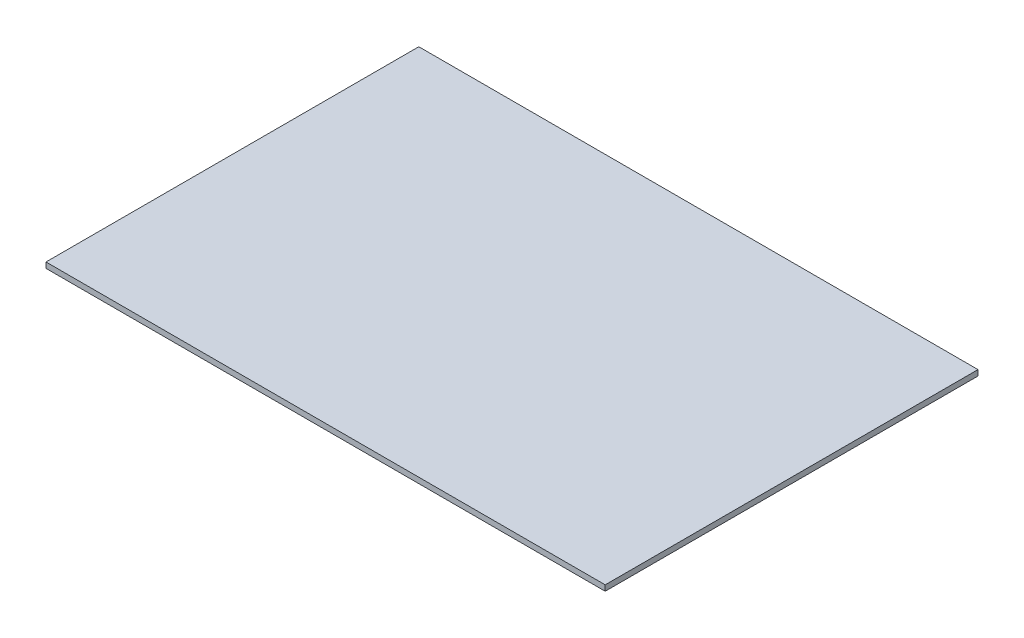
ISO-10303-21;
HEADER;
FILE_DESCRIPTION(('STEP AP214'),'2;1');
FILE_NAME('part.step','',(''),(''),'','','');
FILE_SCHEMA(('AUTOMOTIVE_DESIGN { 1 0 10303 214 1 1 1 1 }'));
ENDSEC;
DATA;
#1=APPLICATION_CONTEXT('core data for automotive mechanical design processes');
#2=APPLICATION_PROTOCOL_DEFINITION('international standard','automotive_design',2000,#1);
#3=PRODUCT_CONTEXT('',#1,'mechanical');
#4=PRODUCT('Part','Part','',(#3));
#5=PRODUCT_RELATED_PRODUCT_CATEGORY('part','',(#4));
#6=PRODUCT_DEFINITION_FORMATION('','',#4);
#7=PRODUCT_DEFINITION_CONTEXT('part definition',#1,'design');
#8=PRODUCT_DEFINITION('design','',#6,#7);
#9=PRODUCT_DEFINITION_SHAPE('','',#8);
#10=(LENGTH_UNIT() NAMED_UNIT(*) SI_UNIT(.MILLI.,.METRE.));
#11=(NAMED_UNIT(*) PLANE_ANGLE_UNIT() SI_UNIT($,.RADIAN.));
#12=(NAMED_UNIT(*) SI_UNIT($,.STERADIAN.) SOLID_ANGLE_UNIT());
#13=UNCERTAINTY_MEASURE_WITH_UNIT(LENGTH_MEASURE(1.E-05),#10,'distance_accuracy_value','');
#14=(GEOMETRIC_REPRESENTATION_CONTEXT(3) GLOBAL_UNCERTAINTY_ASSIGNED_CONTEXT((#13)) GLOBAL_UNIT_ASSIGNED_CONTEXT((#10,
#11,#12)) REPRESENTATION_CONTEXT('',''));
#15=CARTESIAN_POINT('',(0.,0.,0.));
#16=DIRECTION('',(0.,0.,1.));
#17=DIRECTION('',(1.,0.,0.));
#18=AXIS2_PLACEMENT_3D('',#15,#16,#17);
#19=CARTESIAN_POINT('',(150.,3.,100.));
#20=DIRECTION('',(-1.,0.,0.));
#21=DIRECTION('',(0.,0.,1.));
#22=AXIS2_PLACEMENT_3D('',#19,#20,#21);
#23=PLANE('',#22);
#24=DIRECTION('',(0.,0.,-1.));
#25=VECTOR('',#24,1.);
#26=CARTESIAN_POINT('',(150.,0.,100.));
#27=LINE('',#26,#25);
#28=CARTESIAN_POINT('',(150.,0.,100.));
#29=VERTEX_POINT('',#28);
#30=CARTESIAN_POINT('',(150.,0.,-100.));
#31=VERTEX_POINT('',#30);
#32=EDGE_CURVE('E96',#29,#31,#27,.T.);
#33=ORIENTED_EDGE('',*,*,#32,.T.);
#34=DIRECTION('',(0.,-1.,0.));
#35=VECTOR('',#34,1.);
#36=CARTESIAN_POINT('',(150.,3.,-100.));
#37=LINE('',#36,#35);
#38=CARTESIAN_POINT('',(150.,3.,-100.));
#39=VERTEX_POINT('',#38);
#40=EDGE_CURVE('E11',#39,#31,#37,.T.);
#41=ORIENTED_EDGE('',*,*,#40,.F.);
#42=DIRECTION('',(0.,0.,-1.));
#43=VECTOR('',#42,1.);
#44=CARTESIAN_POINT('',(150.,3.,100.));
#45=LINE('',#44,#43);
#46=CARTESIAN_POINT('',(150.,3.,100.));
#47=VERTEX_POINT('',#46);
#48=EDGE_CURVE('E84',#47,#39,#45,.T.);
#49=ORIENTED_EDGE('',*,*,#48,.F.);
#50=DIRECTION('',(0.,-1.,0.));
#51=VECTOR('',#50,1.);
#52=CARTESIAN_POINT('',(150.,3.,100.));
#53=LINE('',#52,#51);
#54=EDGE_CURVE('E92',#47,#29,#53,.T.);
#55=ORIENTED_EDGE('',*,*,#54,.T.);
#56=EDGE_LOOP('',(#33,#41,#49,#55));
#57=FACE_BOUND('',#56,.T.);
#58=ADVANCED_FACE('F33',(#57),#23,.F.);
#59=CARTESIAN_POINT('',(-150.,3.,-100.));
#60=DIRECTION('',(0.,0.,1.));
#61=DIRECTION('',(1.,0.,0.));
#62=AXIS2_PLACEMENT_3D('',#59,#60,#61);
#63=PLANE('',#62);
#64=DIRECTION('',(-1.,0.,0.));
#65=VECTOR('',#64,1.);
#66=CARTESIAN_POINT('',(-150.,0.,-100.));
#67=LINE('',#66,#65);
#68=CARTESIAN_POINT('',(-150.,0.,-100.));
#69=VERTEX_POINT('',#68);
#70=EDGE_CURVE('E88',#31,#69,#67,.T.);
#71=ORIENTED_EDGE('',*,*,#70,.T.);
#72=DIRECTION('',(0.,-1.,0.));
#73=VECTOR('',#72,1.);
#74=CARTESIAN_POINT('',(-150.,3.,-100.));
#75=LINE('',#74,#73);
#76=CARTESIAN_POINT('',(-150.,3.,-100.));
#77=VERTEX_POINT('',#76);
#78=EDGE_CURVE('E41',#77,#69,#75,.T.);
#79=ORIENTED_EDGE('',*,*,#78,.F.);
#80=DIRECTION('',(-1.,0.,0.));
#81=VECTOR('',#80,1.);
#82=CARTESIAN_POINT('',(-150.,3.,-100.));
#83=LINE('',#82,#81);
#84=EDGE_CURVE('E79',#39,#77,#83,.T.);
#85=ORIENTED_EDGE('',*,*,#84,.F.);
#86=ORIENTED_EDGE('',*,*,#40,.T.);
#87=EDGE_LOOP('',(#71,#79,#85,#86));
#88=FACE_BOUND('',#87,.T.);
#89=ADVANCED_FACE('F87',(#88),#63,.F.);
#90=CARTESIAN_POINT('',(-150.,3.,100.));
#91=DIRECTION('',(1.,0.,0.));
#92=DIRECTION('',(0.,0.,-1.));
#93=AXIS2_PLACEMENT_3D('',#90,#91,#92);
#94=PLANE('',#93);
#95=DIRECTION('',(0.,0.,1.));
#96=VECTOR('',#95,1.);
#97=CARTESIAN_POINT('',(-150.,0.,100.));
#98=LINE('',#97,#96);
#99=CARTESIAN_POINT('',(-150.,0.,100.));
#100=VERTEX_POINT('',#99);
#101=EDGE_CURVE('E66',#69,#100,#98,.T.);
#102=ORIENTED_EDGE('',*,*,#101,.T.);
#103=DIRECTION('',(0.,-1.,0.));
#104=VECTOR('',#103,1.);
#105=CARTESIAN_POINT('',(-150.,3.,100.));
#106=LINE('',#105,#104);
#107=CARTESIAN_POINT('',(-150.,3.,100.));
#108=VERTEX_POINT('',#107);
#109=EDGE_CURVE('E89',#108,#100,#106,.T.);
#110=ORIENTED_EDGE('',*,*,#109,.F.);
#111=DIRECTION('',(0.,0.,1.));
#112=VECTOR('',#111,1.);
#113=CARTESIAN_POINT('',(-150.,3.,100.));
#114=LINE('',#113,#112);
#115=EDGE_CURVE('E82',#77,#108,#114,.T.);
#116=ORIENTED_EDGE('',*,*,#115,.F.);
#117=ORIENTED_EDGE('',*,*,#78,.T.);
#118=EDGE_LOOP('',(#102,#110,#116,#117));
#119=FACE_BOUND('',#118,.T.);
#120=ADVANCED_FACE('F90',(#119),#94,.F.);
#121=CARTESIAN_POINT('',(-150.,3.,100.));
#122=DIRECTION('',(0.,0.,-1.));
#123=DIRECTION('',(-1.,0.,0.));
#124=AXIS2_PLACEMENT_3D('',#121,#122,#123);
#125=PLANE('',#124);
#126=DIRECTION('',(1.,0.,0.));
#127=VECTOR('',#126,1.);
#128=CARTESIAN_POINT('',(-150.,0.,100.));
#129=LINE('',#128,#127);
#130=EDGE_CURVE('E72',#100,#29,#129,.T.);
#131=ORIENTED_EDGE('',*,*,#130,.T.);
#132=ORIENTED_EDGE('',*,*,#54,.F.);
#133=DIRECTION('',(1.,0.,0.));
#134=VECTOR('',#133,1.);
#135=CARTESIAN_POINT('',(-150.,3.,100.));
#136=LINE('',#135,#134);
#137=EDGE_CURVE('E49',#108,#47,#136,.T.);
#138=ORIENTED_EDGE('',*,*,#137,.F.);
#139=ORIENTED_EDGE('',*,*,#109,.T.);
#140=EDGE_LOOP('',(#131,#132,#138,#139));
#141=FACE_BOUND('',#140,.T.);
#142=ADVANCED_FACE('F103',(#141),#125,.F.);
#143=CARTESIAN_POINT('',(0.,3.,0.));
#144=DIRECTION('',(0.,-1.,0.));
#145=DIRECTION('',(0.,0.,-1.));
#146=AXIS2_PLACEMENT_3D('',#143,#144,#145);
#147=PLANE('',#146);
#148=ORIENTED_EDGE('',*,*,#48,.T.);
#149=ORIENTED_EDGE('',*,*,#84,.T.);
#150=ORIENTED_EDGE('',*,*,#115,.T.);
#151=ORIENTED_EDGE('',*,*,#137,.T.);
#152=EDGE_LOOP('',(#148,#149,#150,#151));
#153=FACE_BOUND('',#152,.T.);
#154=ADVANCED_FACE('F80',(#153),#147,.F.);
#155=CARTESIAN_POINT('',(0.,0.,0.));
#156=DIRECTION('',(0.,-1.,0.));
#157=DIRECTION('',(0.,0.,-1.));
#158=AXIS2_PLACEMENT_3D('',#155,#156,#157);
#159=PLANE('',#158);
#160=ORIENTED_EDGE('',*,*,#32,.F.);
#161=ORIENTED_EDGE('',*,*,#130,.F.);
#162=ORIENTED_EDGE('',*,*,#101,.F.);
#163=ORIENTED_EDGE('',*,*,#70,.F.);
#164=EDGE_LOOP('',(#160,#161,#162,#163));
#165=FACE_BOUND('',#164,.T.);
#166=ADVANCED_FACE('F106',(#165),#159,.T.);
#167=CLOSED_SHELL('',(#58,#89,#120,#142,#154,#166));
#168=MANIFOLD_SOLID_BREP('B2',#167);
#169=ADVANCED_BREP_SHAPE_REPRESENTATION('',(#18,#168),#14);
#170=SHAPE_DEFINITION_REPRESENTATION(#9,#169);
ENDSEC;
END-ISO-10303-21;
